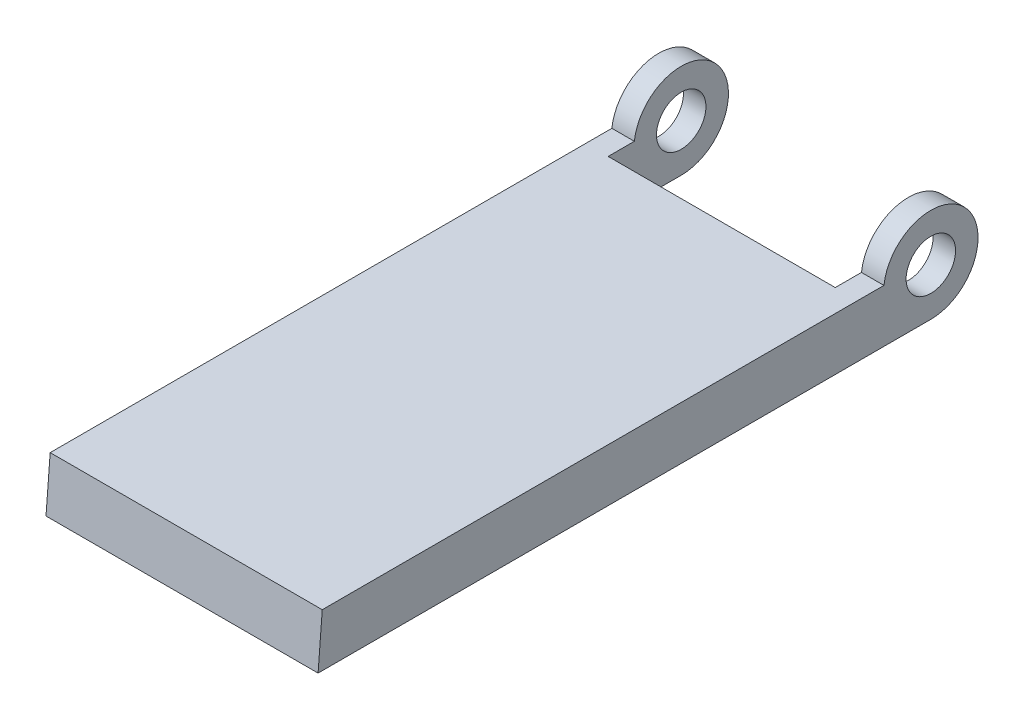
ISO-10303-21;
HEADER;
FILE_DESCRIPTION(('STEP AP214'),'2;1');
FILE_NAME('part.step','',(''),(''),'','','');
FILE_SCHEMA(('AUTOMOTIVE_DESIGN { 1 0 10303 214 1 1 1 1 }'));
ENDSEC;
DATA;
#1=APPLICATION_CONTEXT('core data for automotive mechanical design processes');
#2=APPLICATION_PROTOCOL_DEFINITION('international standard','automotive_design',2000,#1);
#3=PRODUCT_CONTEXT('',#1,'mechanical');
#4=PRODUCT('Part','Part','',(#3));
#5=PRODUCT_RELATED_PRODUCT_CATEGORY('part','',(#4));
#6=PRODUCT_DEFINITION_FORMATION('','',#4);
#7=PRODUCT_DEFINITION_CONTEXT('part definition',#1,'design');
#8=PRODUCT_DEFINITION('design','',#6,#7);
#9=PRODUCT_DEFINITION_SHAPE('','',#8);
#10=(LENGTH_UNIT() NAMED_UNIT(*) SI_UNIT(.MILLI.,.METRE.));
#11=(NAMED_UNIT(*) PLANE_ANGLE_UNIT() SI_UNIT($,.RADIAN.));
#12=(NAMED_UNIT(*) SI_UNIT($,.STERADIAN.) SOLID_ANGLE_UNIT());
#13=UNCERTAINTY_MEASURE_WITH_UNIT(LENGTH_MEASURE(1.E-05),#10,'distance_accuracy_value','');
#14=(GEOMETRIC_REPRESENTATION_CONTEXT(3) GLOBAL_UNCERTAINTY_ASSIGNED_CONTEXT((#13)) GLOBAL_UNIT_ASSIGNED_CONTEXT((#10,
#11,#12)) REPRESENTATION_CONTEXT('',''));
#15=CARTESIAN_POINT('',(0.,0.,0.));
#16=DIRECTION('',(0.,0.,1.));
#17=DIRECTION('',(1.,0.,0.));
#18=AXIS2_PLACEMENT_3D('',#15,#16,#17);
#19=CARTESIAN_POINT('',(-2.,1.5,-2.5));
#20=DIRECTION('',(1.,0.,0.));
#21=DIRECTION('',(0.,0.,-1.));
#22=AXIS2_PLACEMENT_3D('',#19,#20,#21);
#23=CYLINDRICAL_SURFACE('',#22,4.2);
#24=DIRECTION('',(-1.,0.,0.));
#25=VECTOR('',#24,1.);
#26=CARTESIAN_POINT('',(81.4208376694314,-2.7,-2.50000000000001));
#27=LINE('',#26,#25);
#28=CARTESIAN_POINT('',(0.,-2.7,-2.5));
#29=VERTEX_POINT('',#28);
#30=CARTESIAN_POINT('',(-2.,-2.7,-2.5));
#31=VERTEX_POINT('',#30);
#32=EDGE_CURVE('E183',#29,#31,#27,.T.);
#33=ORIENTED_EDGE('',*,*,#32,.T.);
#34=CARTESIAN_POINT('',(-2.,1.5,-2.5));
#35=DIRECTION('',(-1.,0.,0.));
#36=DIRECTION('',(0.,0.,1.));
#37=AXIS2_PLACEMENT_3D('',#34,#35,#36);
#38=CIRCLE('',#37,4.2);
#39=CARTESIAN_POINT('',(-2.,2.,1.67013189239861));
#40=VERTEX_POINT('',#39);
#41=EDGE_CURVE('E11',#40,#31,#38,.T.);
#42=ORIENTED_EDGE('',*,*,#41,.F.);
#43=DIRECTION('',(1.,0.,0.));
#44=VECTOR('',#43,1.);
#45=CARTESIAN_POINT('',(-30.6468918349421,2.,1.67013189239861));
#46=LINE('',#45,#44);
#47=CARTESIAN_POINT('',(0.,2.,1.67013189239861));
#48=VERTEX_POINT('',#47);
#49=EDGE_CURVE('E141',#40,#48,#46,.T.);
#50=ORIENTED_EDGE('',*,*,#49,.T.);
#51=CARTESIAN_POINT('',(0.,1.5,-2.5));
#52=DIRECTION('',(-1.,0.,0.));
#53=DIRECTION('',(0.,0.,1.));
#54=AXIS2_PLACEMENT_3D('',#51,#52,#53);
#55=CIRCLE('',#54,4.2);
#56=EDGE_CURVE('E43',#48,#29,#55,.T.);
#57=ORIENTED_EDGE('',*,*,#56,.T.);
#58=EDGE_LOOP('',(#33,#42,#50,#57));
#59=FACE_BOUND('',#58,.T.);
#60=ADVANCED_FACE('F39',(#59),#23,.T.);
#61=CARTESIAN_POINT('',(0.,1.5,-2.5));
#62=DIRECTION('',(-1.,0.,0.));
#63=DIRECTION('',(0.,0.,1.));
#64=AXIS2_PLACEMENT_3D('',#61,#62,#63);
#65=PLANE('',#64);
#66=DIRECTION('',(0.,0.,1.));
#67=VECTOR('',#66,1.);
#68=CARTESIAN_POINT('',(0.,-2.7,2.55891199399027));
#69=LINE('',#68,#67);
#70=CARTESIAN_POINT('',(0.,-2.7,2.55891199399026));
#71=VERTEX_POINT('',#70);
#72=EDGE_CURVE('E194',#29,#71,#69,.T.);
#73=ORIENTED_EDGE('',*,*,#72,.F.);
#74=ORIENTED_EDGE('',*,*,#56,.F.);
#75=DIRECTION('',(0.,0.,1.));
#76=VECTOR('',#75,1.);
#77=CARTESIAN_POINT('',(0.,2.,0.));
#78=LINE('',#77,#76);
#79=CARTESIAN_POINT('',(0.,2.,4.));
#80=VERTEX_POINT('',#79);
#81=EDGE_CURVE('E206',#48,#80,#78,.T.);
#82=ORIENTED_EDGE('',*,*,#81,.T.);
#83=DIRECTION('',(0.,-0.956068195523658,-0.293144342446067));
#84=VECTOR('',#83,1.);
#85=CARTESIAN_POINT('',(0.,2.,4.));
#86=LINE('',#85,#84);
#87=EDGE_CURVE('E62',#80,#71,#86,.T.);
#88=ORIENTED_EDGE('',*,*,#87,.T.);
#89=EDGE_LOOP('',(#73,#74,#82,#88));
#90=FACE_BOUND('',#89,.T.);
#91=CARTESIAN_POINT('',(0.,1.5,-2.5));
#92=DIRECTION('',(-1.,0.,0.));
#93=DIRECTION('',(0.,0.,1.));
#94=AXIS2_PLACEMENT_3D('',#91,#92,#93);
#95=CIRCLE('',#94,2.2);
#96=CARTESIAN_POINT('',(0.,1.5,-0.3));
#97=VERTEX_POINT('',#96);
#98=EDGE_CURVE('E145',#97,#97,#95,.T.);
#99=ORIENTED_EDGE('',*,*,#98,.T.);
#100=EDGE_LOOP('',(#99));
#101=FACE_BOUND('',#100,.T.);
#102=ADVANCED_FACE('F154',(#90,#101),#65,.F.);
#103=CARTESIAN_POINT('',(20.2,1.5,-2.5));
#104=DIRECTION('',(1.,0.,0.));
#105=DIRECTION('',(0.,0.,1.));
#106=AXIS2_PLACEMENT_3D('',#103,#104,#105);
#107=PLANE('',#106);
#108=CARTESIAN_POINT('',(20.2,1.5,-2.5));
#109=DIRECTION('',(-1.,0.,0.));
#110=DIRECTION('',(0.,0.,1.));
#111=AXIS2_PLACEMENT_3D('',#108,#109,#110);
#112=CIRCLE('',#111,4.2);
#113=CARTESIAN_POINT('',(20.2,2.,1.67013189239861));
#114=VERTEX_POINT('',#113);
#115=CARTESIAN_POINT('',(20.2,-2.7,-2.5));
#116=VERTEX_POINT('',#115);
#117=EDGE_CURVE('E137',#114,#116,#112,.T.);
#118=ORIENTED_EDGE('',*,*,#117,.T.);
#119=DIRECTION('',(0.,0.,1.));
#120=VECTOR('',#119,1.);
#121=CARTESIAN_POINT('',(20.2,-2.7,2.55891199399026));
#122=LINE('',#121,#120);
#123=CARTESIAN_POINT('',(20.2,-2.7,2.55891199399026));
#124=VERTEX_POINT('',#123);
#125=EDGE_CURVE('E111',#116,#124,#122,.T.);
#126=ORIENTED_EDGE('',*,*,#125,.T.);
#127=DIRECTION('',(0.,-0.956068195523658,-0.293144342446067));
#128=VECTOR('',#127,1.);
#129=CARTESIAN_POINT('',(20.2,2.,4.));
#130=LINE('',#129,#128);
#131=CARTESIAN_POINT('',(20.2,2.,4.));
#132=VERTEX_POINT('',#131);
#133=EDGE_CURVE('E201',#132,#124,#130,.T.);
#134=ORIENTED_EDGE('',*,*,#133,.F.);
#135=DIRECTION('',(0.,0.,-1.));
#136=VECTOR('',#135,1.);
#137=CARTESIAN_POINT('',(20.2,2.,0.));
#138=LINE('',#137,#136);
#139=EDGE_CURVE('E126',#132,#114,#138,.T.);
#140=ORIENTED_EDGE('',*,*,#139,.T.);
#141=EDGE_LOOP('',(#118,#126,#134,#140));
#142=FACE_BOUND('',#141,.T.);
#143=CARTESIAN_POINT('',(20.2,1.5,-2.5));
#144=DIRECTION('',(-1.,0.,0.));
#145=DIRECTION('',(0.,0.,1.));
#146=AXIS2_PLACEMENT_3D('',#143,#144,#145);
#147=CIRCLE('',#146,2.2);
#148=CARTESIAN_POINT('',(20.2,1.5,-0.300000000000003));
#149=VERTEX_POINT('',#148);
#150=EDGE_CURVE('E128',#149,#149,#147,.T.);
#151=ORIENTED_EDGE('',*,*,#150,.F.);
#152=EDGE_LOOP('',(#151));
#153=FACE_BOUND('',#152,.T.);
#154=ADVANCED_FACE('F178',(#142,#153),#107,.F.);
#155=CARTESIAN_POINT('',(0.,2.,0.));
#156=DIRECTION('',(0.,1.,0.));
#157=DIRECTION('',(0.,0.,1.));
#158=AXIS2_PLACEMENT_3D('',#155,#156,#157);
#159=PLANE('',#158);
#160=DIRECTION('',(-1.,0.,0.));
#161=VECTOR('',#160,1.);
#162=CARTESIAN_POINT('',(22.201,2.,51.6286499060751));
#163=LINE('',#162,#161);
#164=CARTESIAN_POINT('',(22.2,2.,51.6286499060751));
#165=VERTEX_POINT('',#164);
#166=CARTESIAN_POINT('',(-1.99999999999999,2.,51.6286499060751));
#167=VERTEX_POINT('',#166);
#168=EDGE_CURVE('E105',#165,#167,#163,.T.);
#169=ORIENTED_EDGE('',*,*,#168,.F.);
#170=DIRECTION('',(0.,0.,-1.));
#171=VECTOR('',#170,1.);
#172=CARTESIAN_POINT('',(22.2,2.,30.));
#173=LINE('',#172,#171);
#174=CARTESIAN_POINT('',(22.2,2.,1.6701318923986));
#175=VERTEX_POINT('',#174);
#176=EDGE_CURVE('E116',#165,#175,#173,.T.);
#177=ORIENTED_EDGE('',*,*,#176,.T.);
#178=DIRECTION('',(-1.,0.,0.));
#179=VECTOR('',#178,1.);
#180=CARTESIAN_POINT('',(71.0468918349421,2.,1.6701318923986));
#181=LINE('',#180,#179);
#182=EDGE_CURVE('E125',#175,#114,#181,.T.);
#183=ORIENTED_EDGE('',*,*,#182,.T.);
#184=ORIENTED_EDGE('',*,*,#139,.F.);
#185=DIRECTION('',(1.,0.,0.));
#186=VECTOR('',#185,1.);
#187=CARTESIAN_POINT('',(0.,2.,4.));
#188=LINE('',#187,#186);
#189=EDGE_CURVE('E130',#80,#132,#188,.T.);
#190=ORIENTED_EDGE('',*,*,#189,.F.);
#191=ORIENTED_EDGE('',*,*,#81,.F.);
#192=ORIENTED_EDGE('',*,*,#49,.F.);
#193=DIRECTION('',(0.,0.,-1.));
#194=VECTOR('',#193,1.);
#195=CARTESIAN_POINT('',(-2.,2.,30.));
#196=LINE('',#195,#194);
#197=EDGE_CURVE('E119',#167,#40,#196,.T.);
#198=ORIENTED_EDGE('',*,*,#197,.F.);
#199=EDGE_LOOP('',(#169,#177,#183,#184,#190,#191,#192,#198));
#200=FACE_BOUND('',#199,.T.);
#201=ADVANCED_FACE('F41',(#200),#159,.T.);
#202=CARTESIAN_POINT('',(-2.,1.5,-2.5));
#203=DIRECTION('',(-1.,0.,0.));
#204=DIRECTION('',(0.,0.,1.));
#205=AXIS2_PLACEMENT_3D('',#202,#203,#204);
#206=PLANE('',#205);
#207=DIRECTION('',(0.,-0.996896012024715,0.0787295447034888));
#208=VECTOR('',#207,1.);
#209=CARTESIAN_POINT('',(-1.99999999999999,2.,51.6286499060751));
#210=LINE('',#209,#208);
#211=CARTESIAN_POINT('',(-1.99999999999999,-2.69999999999999,51.9998309075467));
#212=VERTEX_POINT('',#211);
#213=EDGE_CURVE('E54',#167,#212,#210,.T.);
#214=ORIENTED_EDGE('',*,*,#213,.F.);
#215=ORIENTED_EDGE('',*,*,#197,.T.);
#216=ORIENTED_EDGE('',*,*,#41,.T.);
#217=DIRECTION('',(0.,0.,1.));
#218=VECTOR('',#217,1.);
#219=CARTESIAN_POINT('',(-1.99999999999999,-2.69999999999999,55.831397302868));
#220=LINE('',#219,#218);
#221=EDGE_CURVE('E189',#31,#212,#220,.T.);
#222=ORIENTED_EDGE('',*,*,#221,.T.);
#223=EDGE_LOOP('',(#214,#215,#216,#222));
#224=FACE_BOUND('',#223,.T.);
#225=CARTESIAN_POINT('',(-2.,1.5,-2.5));
#226=DIRECTION('',(-1.,0.,0.));
#227=DIRECTION('',(0.,0.,1.));
#228=AXIS2_PLACEMENT_3D('',#225,#226,#227);
#229=CIRCLE('',#228,2.2);
#230=CARTESIAN_POINT('',(-2.,1.5,-0.299999999999999));
#231=VERTEX_POINT('',#230);
#232=EDGE_CURVE('E148',#231,#231,#229,.T.);
#233=ORIENTED_EDGE('',*,*,#232,.F.);
#234=EDGE_LOOP('',(#233));
#235=FACE_BOUND('',#234,.T.);
#236=ADVANCED_FACE('F159',(#224,#235),#206,.T.);
#237=CARTESIAN_POINT('',(-2.,1.5,-2.5));
#238=DIRECTION('',(1.,0.,0.));
#239=DIRECTION('',(0.,0.,-1.));
#240=AXIS2_PLACEMENT_3D('',#237,#238,#239);
#241=CYLINDRICAL_SURFACE('',#240,2.2);
#242=ORIENTED_EDGE('',*,*,#232,.T.);
#243=EDGE_LOOP('',(#242));
#244=FACE_BOUND('',#243,.T.);
#245=ORIENTED_EDGE('',*,*,#98,.F.);
#246=EDGE_LOOP('',(#245));
#247=FACE_BOUND('',#246,.T.);
#248=ADVANCED_FACE('F156',(#244,#247),#241,.F.);
#249=CARTESIAN_POINT('',(22.2,1.5,-2.5));
#250=DIRECTION('',(-1.,0.,0.));
#251=DIRECTION('',(0.,0.,1.));
#252=AXIS2_PLACEMENT_3D('',#249,#250,#251);
#253=CYLINDRICAL_SURFACE('',#252,4.2);
#254=CARTESIAN_POINT('',(22.2,-2.7,-2.5));
#255=VERTEX_POINT('',#254);
#256=EDGE_CURVE('E188',#255,#116,#27,.T.);
#257=ORIENTED_EDGE('',*,*,#256,.T.);
#258=ORIENTED_EDGE('',*,*,#117,.F.);
#259=ORIENTED_EDGE('',*,*,#182,.F.);
#260=CARTESIAN_POINT('',(22.2,1.5,-2.5));
#261=DIRECTION('',(-1.,0.,0.));
#262=DIRECTION('',(0.,0.,1.));
#263=AXIS2_PLACEMENT_3D('',#260,#261,#262);
#264=CIRCLE('',#263,4.2);
#265=EDGE_CURVE('E123',#175,#255,#264,.T.);
#266=ORIENTED_EDGE('',*,*,#265,.T.);
#267=EDGE_LOOP('',(#257,#258,#259,#266));
#268=FACE_BOUND('',#267,.T.);
#269=ADVANCED_FACE('F158',(#268),#253,.T.);
#270=CARTESIAN_POINT('',(22.2,1.5,-2.5));
#271=DIRECTION('',(1.,0.,0.));
#272=DIRECTION('',(0.,0.,1.));
#273=AXIS2_PLACEMENT_3D('',#270,#271,#272);
#274=PLANE('',#273);
#275=DIRECTION('',(0.,-0.996896012024715,0.0787295447034888));
#276=VECTOR('',#275,1.);
#277=CARTESIAN_POINT('',(22.2,2.,51.6286499060751));
#278=LINE('',#277,#276);
#279=CARTESIAN_POINT('',(22.2,-2.7,51.9998309075467));
#280=VERTEX_POINT('',#279);
#281=EDGE_CURVE('E102',#165,#280,#278,.T.);
#282=ORIENTED_EDGE('',*,*,#281,.T.);
#283=DIRECTION('',(0.,0.,1.));
#284=VECTOR('',#283,1.);
#285=CARTESIAN_POINT('',(22.2,-2.69999999999999,55.831397302868));
#286=LINE('',#285,#284);
#287=EDGE_CURVE('E200',#255,#280,#286,.T.);
#288=ORIENTED_EDGE('',*,*,#287,.F.);
#289=ORIENTED_EDGE('',*,*,#265,.F.);
#290=ORIENTED_EDGE('',*,*,#176,.F.);
#291=EDGE_LOOP('',(#282,#288,#289,#290));
#292=FACE_BOUND('',#291,.T.);
#293=CARTESIAN_POINT('',(22.2,1.5,-2.5));
#294=DIRECTION('',(-1.,0.,0.));
#295=DIRECTION('',(0.,0.,1.));
#296=AXIS2_PLACEMENT_3D('',#293,#294,#295);
#297=CIRCLE('',#296,2.2);
#298=CARTESIAN_POINT('',(22.2,1.5,-0.300000000000003));
#299=VERTEX_POINT('',#298);
#300=EDGE_CURVE('E134',#299,#299,#297,.T.);
#301=ORIENTED_EDGE('',*,*,#300,.T.);
#302=EDGE_LOOP('',(#301));
#303=FACE_BOUND('',#302,.T.);
#304=ADVANCED_FACE('F121',(#292,#303),#274,.T.);
#305=CARTESIAN_POINT('',(22.2,1.5,-2.5));
#306=DIRECTION('',(-1.,0.,0.));
#307=DIRECTION('',(0.,0.,1.));
#308=AXIS2_PLACEMENT_3D('',#305,#306,#307);
#309=CYLINDRICAL_SURFACE('',#308,2.2);
#310=ORIENTED_EDGE('',*,*,#300,.F.);
#311=EDGE_LOOP('',(#310));
#312=FACE_BOUND('',#311,.T.);
#313=ORIENTED_EDGE('',*,*,#150,.T.);
#314=EDGE_LOOP('',(#313));
#315=FACE_BOUND('',#314,.T.);
#316=ADVANCED_FACE('F225',(#312,#315),#309,.F.);
#317=CARTESIAN_POINT('',(-2.0919009850595,2.,4.));
#318=DIRECTION('',(0.,-0.293144342446067,0.956068195523658));
#319=DIRECTION('',(0.,-0.956068195523658,-0.293144342446067));
#320=AXIS2_PLACEMENT_3D('',#317,#318,#319);
#321=PLANE('',#320);
#322=ORIENTED_EDGE('',*,*,#87,.F.);
#323=ORIENTED_EDGE('',*,*,#189,.T.);
#324=ORIENTED_EDGE('',*,*,#133,.T.);
#325=DIRECTION('',(1.,0.,0.));
#326=VECTOR('',#325,1.);
#327=CARTESIAN_POINT('',(-6.47642444006219,-2.7,2.55891199399027));
#328=LINE('',#327,#326);
#329=EDGE_CURVE('E196',#71,#124,#328,.T.);
#330=ORIENTED_EDGE('',*,*,#329,.F.);
#331=EDGE_LOOP('',(#322,#323,#324,#330));
#332=FACE_BOUND('',#331,.T.);
#333=ADVANCED_FACE('F210',(#332),#321,.F.);
#334=CARTESIAN_POINT('',(81.4208376694314,-2.69999999999999,55.8313973028679));
#335=DIRECTION('',(0.,-1.,0.));
#336=DIRECTION('',(0.,0.,-1.));
#337=AXIS2_PLACEMENT_3D('',#334,#335,#336);
#338=PLANE('',#337);
#339=DIRECTION('',(-1.,0.,0.));
#340=VECTOR('',#339,1.);
#341=CARTESIAN_POINT('',(22.201,-2.7,51.9998309075467));
#342=LINE('',#341,#340);
#343=EDGE_CURVE('E106',#280,#212,#342,.T.);
#344=ORIENTED_EDGE('',*,*,#343,.T.);
#345=ORIENTED_EDGE('',*,*,#221,.F.);
#346=ORIENTED_EDGE('',*,*,#32,.F.);
#347=ORIENTED_EDGE('',*,*,#72,.T.);
#348=ORIENTED_EDGE('',*,*,#329,.T.);
#349=ORIENTED_EDGE('',*,*,#125,.F.);
#350=ORIENTED_EDGE('',*,*,#256,.F.);
#351=ORIENTED_EDGE('',*,*,#287,.T.);
#352=EDGE_LOOP('',(#344,#345,#346,#347,#348,#349,#350,#351));
#353=FACE_BOUND('',#352,.T.);
#354=ADVANCED_FACE('F193',(#353),#338,.T.);
#355=CARTESIAN_POINT('',(22.201,2.,51.6286499060751));
#356=DIRECTION('',(0.,-0.0787295447034888,-0.996896012024715));
#357=DIRECTION('',(0.,0.996896012024715,-0.0787295447034888));
#358=AXIS2_PLACEMENT_3D('',#355,#356,#357);
#359=PLANE('',#358);
#360=ORIENTED_EDGE('',*,*,#168,.T.);
#361=ORIENTED_EDGE('',*,*,#213,.T.);
#362=ORIENTED_EDGE('',*,*,#343,.F.);
#363=ORIENTED_EDGE('',*,*,#281,.F.);
#364=EDGE_LOOP('',(#360,#361,#362,#363));
#365=FACE_BOUND('',#364,.T.);
#366=ADVANCED_FACE('F104',(#365),#359,.F.);
#367=CLOSED_SHELL('',(#60,#102,#154,#201,#236,#248,#269,#304,#316,#333,#354,#366));
#368=MANIFOLD_SOLID_BREP('B2',#367);
#369=ADVANCED_BREP_SHAPE_REPRESENTATION('',(#18,#368),#14);
#370=SHAPE_DEFINITION_REPRESENTATION(#9,#369);
ENDSEC;
END-ISO-10303-21;
